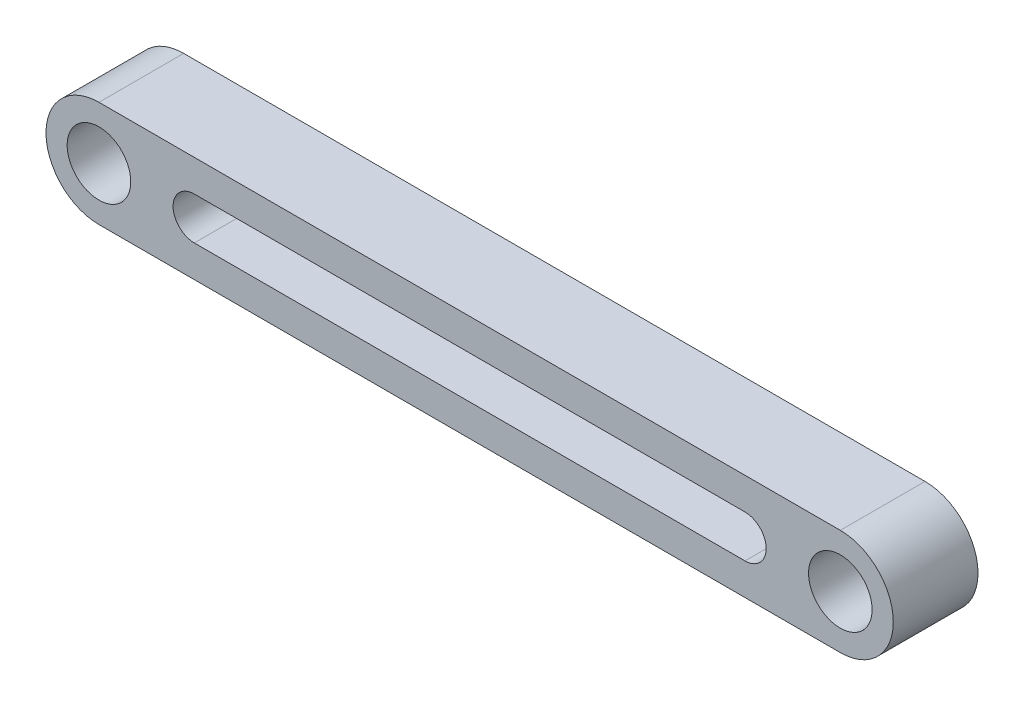
ISO-10303-21;
HEADER;
FILE_DESCRIPTION(('STEP AP214'),'2;1');
FILE_NAME('part.step','',(''),(''),'','','');
FILE_SCHEMA(('AUTOMOTIVE_DESIGN { 1 0 10303 214 1 1 1 1 }'));
ENDSEC;
DATA;
#1=APPLICATION_CONTEXT('core data for automotive mechanical design processes');
#2=APPLICATION_PROTOCOL_DEFINITION('international standard','automotive_design',2000,#1);
#3=PRODUCT_CONTEXT('',#1,'mechanical');
#4=PRODUCT('Part','Part','',(#3));
#5=PRODUCT_RELATED_PRODUCT_CATEGORY('part','',(#4));
#6=PRODUCT_DEFINITION_FORMATION('','',#4);
#7=PRODUCT_DEFINITION_CONTEXT('part definition',#1,'design');
#8=PRODUCT_DEFINITION('design','',#6,#7);
#9=PRODUCT_DEFINITION_SHAPE('','',#8);
#10=(LENGTH_UNIT() NAMED_UNIT(*) SI_UNIT(.MILLI.,.METRE.));
#11=(NAMED_UNIT(*) PLANE_ANGLE_UNIT() SI_UNIT($,.RADIAN.));
#12=(NAMED_UNIT(*) SI_UNIT($,.STERADIAN.) SOLID_ANGLE_UNIT());
#13=UNCERTAINTY_MEASURE_WITH_UNIT(LENGTH_MEASURE(1.E-05),#10,'distance_accuracy_value','');
#14=(GEOMETRIC_REPRESENTATION_CONTEXT(3) GLOBAL_UNCERTAINTY_ASSIGNED_CONTEXT((#13)) GLOBAL_UNIT_ASSIGNED_CONTEXT((#10,
#11,#12)) REPRESENTATION_CONTEXT('',''));
#15=CARTESIAN_POINT('',(0.,0.,0.));
#16=DIRECTION('',(0.,0.,1.));
#17=DIRECTION('',(1.,0.,0.));
#18=AXIS2_PLACEMENT_3D('',#15,#16,#17);
#19=CARTESIAN_POINT('',(0.,0.,4.));
#20=DIRECTION('',(0.,0.,1.));
#21=DIRECTION('',(1.,0.,0.));
#22=AXIS2_PLACEMENT_3D('',#19,#20,#21);
#23=PLANE('',#22);
#24=CARTESIAN_POINT('',(0.,0.,4.));
#25=DIRECTION('',(0.,0.,1.));
#26=DIRECTION('',(1.,0.,0.));
#27=AXIS2_PLACEMENT_3D('',#24,#25,#26);
#28=CIRCLE('',#27,1.5);
#29=CARTESIAN_POINT('',(1.5,0.,4.));
#30=VERTEX_POINT('',#29);
#31=EDGE_CURVE('E146',#30,#30,#28,.T.);
#32=ORIENTED_EDGE('',*,*,#31,.F.);
#33=EDGE_LOOP('',(#32));
#34=FACE_BOUND('',#33,.T.);
#35=CARTESIAN_POINT('',(0.,0.,4.));
#36=DIRECTION('',(0.,0.,1.));
#37=DIRECTION('',(1.,0.,0.));
#38=AXIS2_PLACEMENT_3D('',#35,#36,#37);
#39=CIRCLE('',#38,2.5);
#40=CARTESIAN_POINT('',(0.,2.5,4.));
#41=VERTEX_POINT('',#40);
#42=CARTESIAN_POINT('',(0.,-2.5,4.));
#43=VERTEX_POINT('',#42);
#44=EDGE_CURVE('E152',#41,#43,#39,.T.);
#45=ORIENTED_EDGE('',*,*,#44,.T.);
#46=DIRECTION('',(1.,0.,0.));
#47=VECTOR('',#46,1.);
#48=CARTESIAN_POINT('',(0.,-2.5,4.));
#49=LINE('',#48,#47);
#50=CARTESIAN_POINT('',(35.,-2.5,4.));
#51=VERTEX_POINT('',#50);
#52=EDGE_CURVE('E155',#43,#51,#49,.T.);
#53=ORIENTED_EDGE('',*,*,#52,.T.);
#54=CARTESIAN_POINT('',(35.,0.,4.));
#55=DIRECTION('',(0.,0.,1.));
#56=DIRECTION('',(1.,0.,0.));
#57=AXIS2_PLACEMENT_3D('',#54,#55,#56);
#58=CIRCLE('',#57,2.5);
#59=CARTESIAN_POINT('',(35.,2.5,4.));
#60=VERTEX_POINT('',#59);
#61=EDGE_CURVE('E158',#51,#60,#58,.T.);
#62=ORIENTED_EDGE('',*,*,#61,.T.);
#63=DIRECTION('',(-1.,0.,0.));
#64=VECTOR('',#63,1.);
#65=CARTESIAN_POINT('',(0.,2.5,4.));
#66=LINE('',#65,#64);
#67=EDGE_CURVE('E160',#60,#41,#66,.T.);
#68=ORIENTED_EDGE('',*,*,#67,.T.);
#69=EDGE_LOOP('',(#45,#53,#62,#68));
#70=FACE_BOUND('',#69,.T.);
#71=CARTESIAN_POINT('',(35.,0.,4.));
#72=DIRECTION('',(0.,0.,1.));
#73=DIRECTION('',(1.,0.,0.));
#74=AXIS2_PLACEMENT_3D('',#71,#72,#73);
#75=CIRCLE('',#74,1.5);
#76=CARTESIAN_POINT('',(36.5,0.,4.));
#77=VERTEX_POINT('',#76);
#78=EDGE_CURVE('E140',#77,#77,#75,.T.);
#79=ORIENTED_EDGE('',*,*,#78,.F.);
#80=EDGE_LOOP('',(#79));
#81=FACE_BOUND('',#80,.T.);
#82=DIRECTION('',(1.,0.,0.));
#83=VECTOR('',#82,1.);
#84=CARTESIAN_POINT('',(4.5,-1.,4.));
#85=LINE('',#84,#83);
#86=CARTESIAN_POINT('',(4.5,-1.,4.));
#87=VERTEX_POINT('',#86);
#88=CARTESIAN_POINT('',(30.5,-1.,4.));
#89=VERTEX_POINT('',#88);
#90=EDGE_CURVE('E112',#87,#89,#85,.T.);
#91=ORIENTED_EDGE('',*,*,#90,.F.);
#92=CARTESIAN_POINT('',(4.5,0.,4.));
#93=DIRECTION('',(0.,0.,1.));
#94=DIRECTION('',(1.,0.,0.));
#95=AXIS2_PLACEMENT_3D('',#92,#93,#94);
#96=CIRCLE('',#95,1.);
#97=CARTESIAN_POINT('',(4.5,1.,4.));
#98=VERTEX_POINT('',#97);
#99=EDGE_CURVE('E104',#98,#87,#96,.T.);
#100=ORIENTED_EDGE('',*,*,#99,.F.);
#101=DIRECTION('',(-1.,0.,0.));
#102=VECTOR('',#101,1.);
#103=CARTESIAN_POINT('',(4.5,1.,4.));
#104=LINE('',#103,#102);
#105=CARTESIAN_POINT('',(30.5,1.,4.));
#106=VERTEX_POINT('',#105);
#107=EDGE_CURVE('E126',#106,#98,#104,.T.);
#108=ORIENTED_EDGE('',*,*,#107,.F.);
#109=CARTESIAN_POINT('',(30.5,0.,4.));
#110=DIRECTION('',(0.,0.,1.));
#111=DIRECTION('',(1.,0.,0.));
#112=AXIS2_PLACEMENT_3D('',#109,#110,#111);
#113=CIRCLE('',#112,1.);
#114=EDGE_CURVE('E124',#89,#106,#113,.T.);
#115=ORIENTED_EDGE('',*,*,#114,.F.);
#116=EDGE_LOOP('',(#91,#100,#108,#115));
#117=FACE_BOUND('',#116,.T.);
#118=ADVANCED_FACE('F39',(#34,#70,#81,#117),#23,.T.);
#119=CARTESIAN_POINT('',(0.,0.,0.));
#120=DIRECTION('',(0.,0.,1.));
#121=DIRECTION('',(1.,0.,0.));
#122=AXIS2_PLACEMENT_3D('',#119,#120,#121);
#123=PLANE('',#122);
#124=CARTESIAN_POINT('',(35.,0.,0.));
#125=DIRECTION('',(0.,0.,1.));
#126=DIRECTION('',(1.,0.,0.));
#127=AXIS2_PLACEMENT_3D('',#124,#125,#126);
#128=CIRCLE('',#127,1.5);
#129=CARTESIAN_POINT('',(36.5,0.,0.));
#130=VERTEX_POINT('',#129);
#131=EDGE_CURVE('E120',#130,#130,#128,.T.);
#132=ORIENTED_EDGE('',*,*,#131,.T.);
#133=EDGE_LOOP('',(#132));
#134=FACE_BOUND('',#133,.T.);
#135=CARTESIAN_POINT('',(0.,0.,0.));
#136=DIRECTION('',(0.,0.,1.));
#137=DIRECTION('',(1.,0.,0.));
#138=AXIS2_PLACEMENT_3D('',#135,#136,#137);
#139=CIRCLE('',#138,1.5);
#140=CARTESIAN_POINT('',(1.5,0.,0.));
#141=VERTEX_POINT('',#140);
#142=EDGE_CURVE('E143',#141,#141,#139,.T.);
#143=ORIENTED_EDGE('',*,*,#142,.T.);
#144=EDGE_LOOP('',(#143));
#145=FACE_BOUND('',#144,.T.);
#146=CARTESIAN_POINT('',(0.,0.,0.));
#147=DIRECTION('',(0.,0.,1.));
#148=DIRECTION('',(1.,0.,0.));
#149=AXIS2_PLACEMENT_3D('',#146,#147,#148);
#150=CIRCLE('',#149,2.5);
#151=CARTESIAN_POINT('',(0.,2.5,0.));
#152=VERTEX_POINT('',#151);
#153=CARTESIAN_POINT('',(0.,-2.5,0.));
#154=VERTEX_POINT('',#153);
#155=EDGE_CURVE('E149',#152,#154,#150,.T.);
#156=ORIENTED_EDGE('',*,*,#155,.F.);
#157=DIRECTION('',(-1.,0.,0.));
#158=VECTOR('',#157,1.);
#159=CARTESIAN_POINT('',(0.,2.5,0.));
#160=LINE('',#159,#158);
#161=CARTESIAN_POINT('',(35.,2.5,0.));
#162=VERTEX_POINT('',#161);
#163=EDGE_CURVE('E156',#162,#152,#160,.T.);
#164=ORIENTED_EDGE('',*,*,#163,.F.);
#165=CARTESIAN_POINT('',(35.,0.,0.));
#166=DIRECTION('',(0.,0.,1.));
#167=DIRECTION('',(1.,0.,0.));
#168=AXIS2_PLACEMENT_3D('',#165,#166,#167);
#169=CIRCLE('',#168,2.5);
#170=CARTESIAN_POINT('',(35.,-2.5,0.));
#171=VERTEX_POINT('',#170);
#172=EDGE_CURVE('E167',#171,#162,#169,.T.);
#173=ORIENTED_EDGE('',*,*,#172,.F.);
#174=DIRECTION('',(1.,0.,0.));
#175=VECTOR('',#174,1.);
#176=CARTESIAN_POINT('',(0.,-2.5,0.));
#177=LINE('',#176,#175);
#178=EDGE_CURVE('E165',#154,#171,#177,.T.);
#179=ORIENTED_EDGE('',*,*,#178,.F.);
#180=EDGE_LOOP('',(#156,#164,#173,#179));
#181=FACE_BOUND('',#180,.T.);
#182=CARTESIAN_POINT('',(4.5,0.,0.));
#183=DIRECTION('',(0.,0.,1.));
#184=DIRECTION('',(1.,0.,0.));
#185=AXIS2_PLACEMENT_3D('',#182,#183,#184);
#186=CIRCLE('',#185,1.);
#187=CARTESIAN_POINT('',(4.5,1.,0.));
#188=VERTEX_POINT('',#187);
#189=CARTESIAN_POINT('',(4.5,-1.,0.));
#190=VERTEX_POINT('',#189);
#191=EDGE_CURVE('E62',#188,#190,#186,.T.);
#192=ORIENTED_EDGE('',*,*,#191,.T.);
#193=DIRECTION('',(1.,0.,0.));
#194=VECTOR('',#193,1.);
#195=CARTESIAN_POINT('',(4.5,-1.,0.));
#196=LINE('',#195,#194);
#197=CARTESIAN_POINT('',(30.5,-1.,0.));
#198=VERTEX_POINT('',#197);
#199=EDGE_CURVE('E119',#190,#198,#196,.T.);
#200=ORIENTED_EDGE('',*,*,#199,.T.);
#201=CARTESIAN_POINT('',(30.5,0.,0.));
#202=DIRECTION('',(0.,0.,1.));
#203=DIRECTION('',(1.,0.,0.));
#204=AXIS2_PLACEMENT_3D('',#201,#202,#203);
#205=CIRCLE('',#204,1.);
#206=CARTESIAN_POINT('',(30.5,1.,0.));
#207=VERTEX_POINT('',#206);
#208=EDGE_CURVE('E132',#198,#207,#205,.T.);
#209=ORIENTED_EDGE('',*,*,#208,.T.);
#210=DIRECTION('',(-1.,0.,0.));
#211=VECTOR('',#210,1.);
#212=CARTESIAN_POINT('',(4.5,1.,0.));
#213=LINE('',#212,#211);
#214=EDGE_CURVE('E113',#207,#188,#213,.T.);
#215=ORIENTED_EDGE('',*,*,#214,.T.);
#216=EDGE_LOOP('',(#192,#200,#209,#215));
#217=FACE_BOUND('',#216,.T.);
#218=ADVANCED_FACE('F185',(#134,#145,#181,#217),#123,.F.);
#219=CARTESIAN_POINT('',(0.,0.,4.));
#220=DIRECTION('',(0.,0.,-1.));
#221=DIRECTION('',(-1.,0.,0.));
#222=AXIS2_PLACEMENT_3D('',#219,#220,#221);
#223=CYLINDRICAL_SURFACE('',#222,2.5);
#224=ORIENTED_EDGE('',*,*,#155,.T.);
#225=DIRECTION('',(0.,0.,-1.));
#226=VECTOR('',#225,1.);
#227=CARTESIAN_POINT('',(0.,-2.5,4.));
#228=LINE('',#227,#226);
#229=EDGE_CURVE('E11',#43,#154,#228,.T.);
#230=ORIENTED_EDGE('',*,*,#229,.F.);
#231=ORIENTED_EDGE('',*,*,#44,.F.);
#232=DIRECTION('',(0.,0.,-1.));
#233=VECTOR('',#232,1.);
#234=CARTESIAN_POINT('',(0.,2.5,4.));
#235=LINE('',#234,#233);
#236=EDGE_CURVE('E162',#41,#152,#235,.T.);
#237=ORIENTED_EDGE('',*,*,#236,.T.);
#238=EDGE_LOOP('',(#224,#230,#231,#237));
#239=FACE_BOUND('',#238,.T.);
#240=ADVANCED_FACE('F41',(#239),#223,.T.);
#241=CARTESIAN_POINT('',(0.,-2.5,4.));
#242=DIRECTION('',(0.,1.,0.));
#243=DIRECTION('',(0.,0.,1.));
#244=AXIS2_PLACEMENT_3D('',#241,#242,#243);
#245=PLANE('',#244);
#246=ORIENTED_EDGE('',*,*,#178,.T.);
#247=DIRECTION('',(0.,0.,-1.));
#248=VECTOR('',#247,1.);
#249=CARTESIAN_POINT('',(35.,-2.5,4.));
#250=LINE('',#249,#248);
#251=EDGE_CURVE('E47',#51,#171,#250,.T.);
#252=ORIENTED_EDGE('',*,*,#251,.F.);
#253=ORIENTED_EDGE('',*,*,#52,.F.);
#254=ORIENTED_EDGE('',*,*,#229,.T.);
#255=EDGE_LOOP('',(#246,#252,#253,#254));
#256=FACE_BOUND('',#255,.T.);
#257=ADVANCED_FACE('F196',(#256),#245,.F.);
#258=CARTESIAN_POINT('',(35.,0.,4.));
#259=DIRECTION('',(0.,0.,-1.));
#260=DIRECTION('',(-1.,0.,0.));
#261=AXIS2_PLACEMENT_3D('',#258,#259,#260);
#262=CYLINDRICAL_SURFACE('',#261,2.5);
#263=ORIENTED_EDGE('',*,*,#172,.T.);
#264=DIRECTION('',(0.,0.,-1.));
#265=VECTOR('',#264,1.);
#266=CARTESIAN_POINT('',(35.,2.5,4.));
#267=LINE('',#266,#265);
#268=EDGE_CURVE('E172',#60,#162,#267,.T.);
#269=ORIENTED_EDGE('',*,*,#268,.F.);
#270=ORIENTED_EDGE('',*,*,#61,.F.);
#271=ORIENTED_EDGE('',*,*,#251,.T.);
#272=EDGE_LOOP('',(#263,#269,#270,#271));
#273=FACE_BOUND('',#272,.T.);
#274=ADVANCED_FACE('F179',(#273),#262,.T.);
#275=CARTESIAN_POINT('',(0.,2.5,4.));
#276=DIRECTION('',(0.,-1.,0.));
#277=DIRECTION('',(0.,0.,-1.));
#278=AXIS2_PLACEMENT_3D('',#275,#276,#277);
#279=PLANE('',#278);
#280=ORIENTED_EDGE('',*,*,#163,.T.);
#281=ORIENTED_EDGE('',*,*,#236,.F.);
#282=ORIENTED_EDGE('',*,*,#67,.F.);
#283=ORIENTED_EDGE('',*,*,#268,.T.);
#284=EDGE_LOOP('',(#280,#281,#282,#283));
#285=FACE_BOUND('',#284,.T.);
#286=ADVANCED_FACE('F189',(#285),#279,.F.);
#287=CARTESIAN_POINT('',(0.,0.,4.));
#288=DIRECTION('',(0.,0.,-1.));
#289=DIRECTION('',(-1.,0.,0.));
#290=AXIS2_PLACEMENT_3D('',#287,#288,#289);
#291=CYLINDRICAL_SURFACE('',#290,1.5);
#292=ORIENTED_EDGE('',*,*,#31,.T.);
#293=EDGE_LOOP('',(#292));
#294=FACE_BOUND('',#293,.T.);
#295=ORIENTED_EDGE('',*,*,#142,.F.);
#296=EDGE_LOOP('',(#295));
#297=FACE_BOUND('',#296,.T.);
#298=ADVANCED_FACE('F213',(#294,#297),#291,.F.);
#299=CARTESIAN_POINT('',(35.,0.,4.));
#300=DIRECTION('',(0.,0.,-1.));
#301=DIRECTION('',(-1.,0.,0.));
#302=AXIS2_PLACEMENT_3D('',#299,#300,#301);
#303=CYLINDRICAL_SURFACE('',#302,1.5);
#304=ORIENTED_EDGE('',*,*,#78,.T.);
#305=EDGE_LOOP('',(#304));
#306=FACE_BOUND('',#305,.T.);
#307=ORIENTED_EDGE('',*,*,#131,.F.);
#308=EDGE_LOOP('',(#307));
#309=FACE_BOUND('',#308,.T.);
#310=ADVANCED_FACE('F220',(#306,#309),#303,.F.);
#311=CARTESIAN_POINT('',(4.5,0.,4.));
#312=DIRECTION('',(0.,0.,-1.));
#313=DIRECTION('',(-1.,0.,0.));
#314=AXIS2_PLACEMENT_3D('',#311,#312,#313);
#315=CYLINDRICAL_SURFACE('',#314,1.);
#316=ORIENTED_EDGE('',*,*,#191,.F.);
#317=DIRECTION('',(0.,0.,-1.));
#318=VECTOR('',#317,1.);
#319=CARTESIAN_POINT('',(4.5,1.,4.));
#320=LINE('',#319,#318);
#321=EDGE_CURVE('E108',#98,#188,#320,.T.);
#322=ORIENTED_EDGE('',*,*,#321,.F.);
#323=ORIENTED_EDGE('',*,*,#99,.T.);
#324=DIRECTION('',(0.,0.,-1.));
#325=VECTOR('',#324,1.);
#326=CARTESIAN_POINT('',(4.5,-1.,4.));
#327=LINE('',#326,#325);
#328=EDGE_CURVE('E107',#87,#190,#327,.T.);
#329=ORIENTED_EDGE('',*,*,#328,.T.);
#330=EDGE_LOOP('',(#316,#322,#323,#329));
#331=FACE_BOUND('',#330,.T.);
#332=ADVANCED_FACE('F106',(#331),#315,.F.);
#333=CARTESIAN_POINT('',(4.5,-1.,4.));
#334=DIRECTION('',(0.,1.,0.));
#335=DIRECTION('',(0.,0.,1.));
#336=AXIS2_PLACEMENT_3D('',#333,#334,#335);
#337=PLANE('',#336);
#338=ORIENTED_EDGE('',*,*,#199,.F.);
#339=ORIENTED_EDGE('',*,*,#328,.F.);
#340=ORIENTED_EDGE('',*,*,#90,.T.);
#341=DIRECTION('',(0.,0.,-1.));
#342=VECTOR('',#341,1.);
#343=CARTESIAN_POINT('',(30.5,-1.,4.));
#344=LINE('',#343,#342);
#345=EDGE_CURVE('E121',#89,#198,#344,.T.);
#346=ORIENTED_EDGE('',*,*,#345,.T.);
#347=EDGE_LOOP('',(#338,#339,#340,#346));
#348=FACE_BOUND('',#347,.T.);
#349=ADVANCED_FACE('F116',(#348),#337,.T.);
#350=CARTESIAN_POINT('',(30.5,0.,4.));
#351=DIRECTION('',(0.,0.,-1.));
#352=DIRECTION('',(-1.,0.,0.));
#353=AXIS2_PLACEMENT_3D('',#350,#351,#352);
#354=CYLINDRICAL_SURFACE('',#353,1.);
#355=ORIENTED_EDGE('',*,*,#208,.F.);
#356=ORIENTED_EDGE('',*,*,#345,.F.);
#357=ORIENTED_EDGE('',*,*,#114,.T.);
#358=DIRECTION('',(0.,0.,-1.));
#359=VECTOR('',#358,1.);
#360=CARTESIAN_POINT('',(30.5,1.,4.));
#361=LINE('',#360,#359);
#362=EDGE_CURVE('E54',#106,#207,#361,.T.);
#363=ORIENTED_EDGE('',*,*,#362,.T.);
#364=EDGE_LOOP('',(#355,#356,#357,#363));
#365=FACE_BOUND('',#364,.T.);
#366=ADVANCED_FACE('F237',(#365),#354,.F.);
#367=CARTESIAN_POINT('',(4.5,1.,4.));
#368=DIRECTION('',(0.,-1.,0.));
#369=DIRECTION('',(0.,0.,-1.));
#370=AXIS2_PLACEMENT_3D('',#367,#368,#369);
#371=PLANE('',#370);
#372=ORIENTED_EDGE('',*,*,#214,.F.);
#373=ORIENTED_EDGE('',*,*,#362,.F.);
#374=ORIENTED_EDGE('',*,*,#107,.T.);
#375=ORIENTED_EDGE('',*,*,#321,.T.);
#376=EDGE_LOOP('',(#372,#373,#374,#375));
#377=FACE_BOUND('',#376,.T.);
#378=ADVANCED_FACE('F240',(#377),#371,.T.);
#379=CLOSED_SHELL('',(#118,#218,#240,#257,#274,#286,#298,#310,#332,#349,#366,#378));
#380=MANIFOLD_SOLID_BREP('B2',#379);
#381=ADVANCED_BREP_SHAPE_REPRESENTATION('',(#18,#380),#14);
#382=SHAPE_DEFINITION_REPRESENTATION(#9,#381);
ENDSEC;
END-ISO-10303-21;
